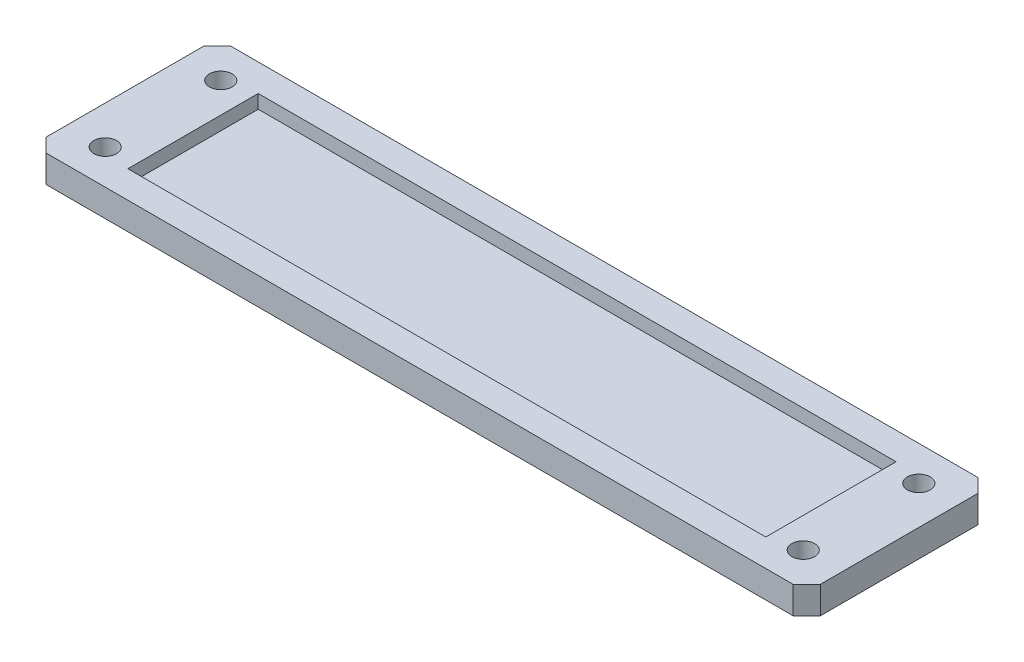
ISO-10303-21;
HEADER;
FILE_DESCRIPTION(('STEP AP214'),'2;1');
FILE_NAME('part.step','',(''),(''),'','','');
FILE_SCHEMA(('AUTOMOTIVE_DESIGN { 1 0 10303 214 1 1 1 1 }'));
ENDSEC;
DATA;
#1=APPLICATION_CONTEXT('core data for automotive mechanical design processes');
#2=APPLICATION_PROTOCOL_DEFINITION('international standard','automotive_design',2000,#1);
#3=PRODUCT_CONTEXT('',#1,'mechanical');
#4=PRODUCT('Part','Part','',(#3));
#5=PRODUCT_RELATED_PRODUCT_CATEGORY('part','',(#4));
#6=PRODUCT_DEFINITION_FORMATION('','',#4);
#7=PRODUCT_DEFINITION_CONTEXT('part definition',#1,'design');
#8=PRODUCT_DEFINITION('design','',#6,#7);
#9=PRODUCT_DEFINITION_SHAPE('','',#8);
#10=(LENGTH_UNIT() NAMED_UNIT(*) SI_UNIT(.MILLI.,.METRE.));
#11=(NAMED_UNIT(*) PLANE_ANGLE_UNIT() SI_UNIT($,.RADIAN.));
#12=(NAMED_UNIT(*) SI_UNIT($,.STERADIAN.) SOLID_ANGLE_UNIT());
#13=UNCERTAINTY_MEASURE_WITH_UNIT(LENGTH_MEASURE(1.E-05),#10,'distance_accuracy_value','');
#14=(GEOMETRIC_REPRESENTATION_CONTEXT(3) GLOBAL_UNCERTAINTY_ASSIGNED_CONTEXT((#13)) GLOBAL_UNIT_ASSIGNED_CONTEXT((#10,
#11,#12)) REPRESENTATION_CONTEXT('',''));
#15=CARTESIAN_POINT('',(0.,0.,0.));
#16=DIRECTION('',(0.,0.,1.));
#17=DIRECTION('',(1.,0.,0.));
#18=AXIS2_PLACEMENT_3D('',#15,#16,#17);
#19=CARTESIAN_POINT('',(0.,6.,0.));
#20=DIRECTION('',(0.,-1.,0.));
#21=DIRECTION('',(0.,0.,-1.));
#22=AXIS2_PLACEMENT_3D('',#19,#20,#21);
#23=PLANE('',#22);
#24=DIRECTION('',(-1.,0.,0.));
#25=VECTOR('',#24,1.);
#26=CARTESIAN_POINT('',(-70.09,6.,-14.32));
#27=LINE('',#26,#25);
#28=CARTESIAN_POINT('',(70.09,6.,-14.32));
#29=VERTEX_POINT('',#28);
#30=CARTESIAN_POINT('',(-70.09,6.,-14.32));
#31=VERTEX_POINT('',#30);
#32=EDGE_CURVE('E233',#29,#31,#27,.T.);
#33=ORIENTED_EDGE('',*,*,#32,.F.);
#34=DIRECTION('',(0.,0.,-1.));
#35=VECTOR('',#34,1.);
#36=CARTESIAN_POINT('',(70.09,6.,-14.32));
#37=LINE('',#36,#35);
#38=CARTESIAN_POINT('',(70.09,6.,14.32));
#39=VERTEX_POINT('',#38);
#40=EDGE_CURVE('E48',#39,#29,#37,.T.);
#41=ORIENTED_EDGE('',*,*,#40,.F.);
#42=DIRECTION('',(1.,0.,0.));
#43=VECTOR('',#42,1.);
#44=CARTESIAN_POINT('',(-70.09,6.,14.32));
#45=LINE('',#44,#43);
#46=CARTESIAN_POINT('',(-70.09,6.,14.32));
#47=VERTEX_POINT('',#46);
#48=EDGE_CURVE('E226',#47,#39,#45,.T.);
#49=ORIENTED_EDGE('',*,*,#48,.F.);
#50=DIRECTION('',(0.,0.,1.));
#51=VECTOR('',#50,1.);
#52=CARTESIAN_POINT('',(-70.09,6.,-14.32));
#53=LINE('',#52,#51);
#54=EDGE_CURVE('E230',#31,#47,#53,.T.);
#55=ORIENTED_EDGE('',*,*,#54,.F.);
#56=EDGE_LOOP('',(#33,#41,#49,#55));
#57=FACE_BOUND('',#56,.T.);
#58=DIRECTION('',(0.,0.,1.));
#59=VECTOR('',#58,1.);
#60=CARTESIAN_POINT('',(-85.09,6.,17.32));
#61=LINE('',#60,#59);
#62=CARTESIAN_POINT('',(-85.09,6.,-17.32));
#63=VERTEX_POINT('',#62);
#64=CARTESIAN_POINT('',(-85.09,6.,17.32));
#65=VERTEX_POINT('',#64);
#66=EDGE_CURVE('E158',#63,#65,#61,.T.);
#67=ORIENTED_EDGE('',*,*,#66,.T.);
#68=DIRECTION('',(0.707106781186548,0.,0.707106781186547));
#69=VECTOR('',#68,1.);
#70=CARTESIAN_POINT('',(-85.09,6.,17.32));
#71=LINE('',#70,#69);
#72=CARTESIAN_POINT('',(-82.09,6.,20.32));
#73=VERTEX_POINT('',#72);
#74=EDGE_CURVE('E98',#65,#73,#71,.T.);
#75=ORIENTED_EDGE('',*,*,#74,.T.);
#76=DIRECTION('',(1.,0.,0.));
#77=VECTOR('',#76,1.);
#78=CARTESIAN_POINT('',(-82.09,6.,20.32));
#79=LINE('',#78,#77);
#80=CARTESIAN_POINT('',(82.09,6.,20.32));
#81=VERTEX_POINT('',#80);
#82=EDGE_CURVE('E173',#73,#81,#79,.T.);
#83=ORIENTED_EDGE('',*,*,#82,.T.);
#84=DIRECTION('',(0.707106781186548,0.,-0.707106781186547));
#85=VECTOR('',#84,1.);
#86=CARTESIAN_POINT('',(82.09,6.,20.32));
#87=LINE('',#86,#85);
#88=CARTESIAN_POINT('',(85.09,6.,17.32));
#89=VERTEX_POINT('',#88);
#90=EDGE_CURVE('E186',#81,#89,#87,.T.);
#91=ORIENTED_EDGE('',*,*,#90,.T.);
#92=DIRECTION('',(0.,0.,-1.));
#93=VECTOR('',#92,1.);
#94=CARTESIAN_POINT('',(85.09,6.,17.32));
#95=LINE('',#94,#93);
#96=CARTESIAN_POINT('',(85.09,6.,-17.32));
#97=VERTEX_POINT('',#96);
#98=EDGE_CURVE('E121',#89,#97,#95,.T.);
#99=ORIENTED_EDGE('',*,*,#98,.T.);
#100=DIRECTION('',(-0.707106781186548,0.,-0.707106781186547));
#101=VECTOR('',#100,1.);
#102=CARTESIAN_POINT('',(82.09,6.,-20.32));
#103=LINE('',#102,#101);
#104=CARTESIAN_POINT('',(82.09,6.,-20.32));
#105=VERTEX_POINT('',#104);
#106=EDGE_CURVE('E114',#97,#105,#103,.T.);
#107=ORIENTED_EDGE('',*,*,#106,.T.);
#108=DIRECTION('',(-1.,0.,0.));
#109=VECTOR('',#108,1.);
#110=CARTESIAN_POINT('',(-82.09,6.,-20.32));
#111=LINE('',#110,#109);
#112=CARTESIAN_POINT('',(-82.09,6.,-20.32));
#113=VERTEX_POINT('',#112);
#114=EDGE_CURVE('E118',#105,#113,#111,.T.);
#115=ORIENTED_EDGE('',*,*,#114,.T.);
#116=DIRECTION('',(-0.707106781186548,0.,0.707106781186547));
#117=VECTOR('',#116,1.);
#118=CARTESIAN_POINT('',(-85.09,6.,-17.32));
#119=LINE('',#118,#117);
#120=EDGE_CURVE('E57',#113,#63,#119,.T.);
#121=ORIENTED_EDGE('',*,*,#120,.T.);
#122=EDGE_LOOP('',(#67,#75,#83,#91,#99,#107,#115,#121));
#123=FACE_BOUND('',#122,.T.);
#124=CARTESIAN_POINT('',(-76.7,6.,-12.7));
#125=DIRECTION('',(0.,1.,0.));
#126=DIRECTION('',(0.,0.,1.));
#127=AXIS2_PLACEMENT_3D('',#124,#125,#126);
#128=CIRCLE('',#127,2.50000000000001);
#129=CARTESIAN_POINT('',(-76.7,6.,-10.2));
#130=VERTEX_POINT('',#129);
#131=EDGE_CURVE('E146',#130,#130,#128,.T.);
#132=ORIENTED_EDGE('',*,*,#131,.F.);
#133=EDGE_LOOP('',(#132));
#134=FACE_BOUND('',#133,.T.);
#135=CARTESIAN_POINT('',(-76.7,6.,12.7));
#136=DIRECTION('',(0.,1.,0.));
#137=DIRECTION('',(0.,0.,1.));
#138=AXIS2_PLACEMENT_3D('',#135,#136,#137);
#139=CIRCLE('',#138,2.5);
#140=CARTESIAN_POINT('',(-76.7,6.,15.2));
#141=VERTEX_POINT('',#140);
#142=EDGE_CURVE('E195',#141,#141,#139,.T.);
#143=ORIENTED_EDGE('',*,*,#142,.F.);
#144=EDGE_LOOP('',(#143));
#145=FACE_BOUND('',#144,.T.);
#146=CARTESIAN_POINT('',(76.7,6.,-12.7));
#147=DIRECTION('',(0.,1.,0.));
#148=DIRECTION('',(0.,0.,1.));
#149=AXIS2_PLACEMENT_3D('',#146,#147,#148);
#150=CIRCLE('',#149,2.49999999999999);
#151=CARTESIAN_POINT('',(76.7,6.,-10.2));
#152=VERTEX_POINT('',#151);
#153=EDGE_CURVE('E201',#152,#152,#150,.T.);
#154=ORIENTED_EDGE('',*,*,#153,.F.);
#155=EDGE_LOOP('',(#154));
#156=FACE_BOUND('',#155,.T.);
#157=CARTESIAN_POINT('',(76.7,6.,12.7));
#158=DIRECTION('',(0.,1.,0.));
#159=DIRECTION('',(0.,0.,1.));
#160=AXIS2_PLACEMENT_3D('',#157,#158,#159);
#161=CIRCLE('',#160,2.49999999999999);
#162=CARTESIAN_POINT('',(76.7,6.,15.2));
#163=VERTEX_POINT('',#162);
#164=EDGE_CURVE('E207',#163,#163,#161,.T.);
#165=ORIENTED_EDGE('',*,*,#164,.F.);
#166=EDGE_LOOP('',(#165));
#167=FACE_BOUND('',#166,.T.);
#168=ADVANCED_FACE('F33',(#57,#123,#134,#145,#156,#167),#23,.F.);
#169=CARTESIAN_POINT('',(0.,0.,0.));
#170=DIRECTION('',(0.,-1.,0.));
#171=DIRECTION('',(0.,0.,-1.));
#172=AXIS2_PLACEMENT_3D('',#169,#170,#171);
#173=PLANE('',#172);
#174=CARTESIAN_POINT('',(76.7,0.,-12.7));
#175=DIRECTION('',(0.,1.,0.));
#176=DIRECTION('',(0.,0.,1.));
#177=AXIS2_PLACEMENT_3D('',#174,#175,#176);
#178=CIRCLE('',#177,2.49999999999999);
#179=CARTESIAN_POINT('',(76.7,0.,-10.2));
#180=VERTEX_POINT('',#179);
#181=EDGE_CURVE('E204',#180,#180,#178,.T.);
#182=ORIENTED_EDGE('',*,*,#181,.T.);
#183=EDGE_LOOP('',(#182));
#184=FACE_BOUND('',#183,.T.);
#185=CARTESIAN_POINT('',(-76.7,0.,-12.7));
#186=DIRECTION('',(0.,1.,0.));
#187=DIRECTION('',(0.,0.,1.));
#188=AXIS2_PLACEMENT_3D('',#185,#186,#187);
#189=CIRCLE('',#188,2.50000000000001);
#190=CARTESIAN_POINT('',(-76.7,0.,-10.2));
#191=VERTEX_POINT('',#190);
#192=EDGE_CURVE('E192',#191,#191,#189,.T.);
#193=ORIENTED_EDGE('',*,*,#192,.T.);
#194=EDGE_LOOP('',(#193));
#195=FACE_BOUND('',#194,.T.);
#196=DIRECTION('',(0.,0.,1.));
#197=VECTOR('',#196,1.);
#198=CARTESIAN_POINT('',(-85.09,0.,17.32));
#199=LINE('',#198,#197);
#200=CARTESIAN_POINT('',(-85.09,0.,-17.32));
#201=VERTEX_POINT('',#200);
#202=CARTESIAN_POINT('',(-85.09,0.,17.32));
#203=VERTEX_POINT('',#202);
#204=EDGE_CURVE('E142',#201,#203,#199,.T.);
#205=ORIENTED_EDGE('',*,*,#204,.F.);
#206=DIRECTION('',(-0.707106781186548,0.,0.707106781186547));
#207=VECTOR('',#206,1.);
#208=CARTESIAN_POINT('',(-85.09,0.,-17.32));
#209=LINE('',#208,#207);
#210=CARTESIAN_POINT('',(-82.09,0.,-20.32));
#211=VERTEX_POINT('',#210);
#212=EDGE_CURVE('E90',#211,#201,#209,.T.);
#213=ORIENTED_EDGE('',*,*,#212,.F.);
#214=DIRECTION('',(-1.,0.,0.));
#215=VECTOR('',#214,1.);
#216=CARTESIAN_POINT('',(-82.09,0.,-20.32));
#217=LINE('',#216,#215);
#218=CARTESIAN_POINT('',(82.09,0.,-20.32));
#219=VERTEX_POINT('',#218);
#220=EDGE_CURVE('E155',#219,#211,#217,.T.);
#221=ORIENTED_EDGE('',*,*,#220,.F.);
#222=DIRECTION('',(-0.707106781186548,0.,-0.707106781186547));
#223=VECTOR('',#222,1.);
#224=CARTESIAN_POINT('',(82.09,0.,-20.32));
#225=LINE('',#224,#223);
#226=CARTESIAN_POINT('',(85.09,0.,-17.32));
#227=VERTEX_POINT('',#226);
#228=EDGE_CURVE('E130',#227,#219,#225,.T.);
#229=ORIENTED_EDGE('',*,*,#228,.F.);
#230=DIRECTION('',(0.,0.,-1.));
#231=VECTOR('',#230,1.);
#232=CARTESIAN_POINT('',(85.09,0.,17.32));
#233=LINE('',#232,#231);
#234=CARTESIAN_POINT('',(85.09,0.,17.32));
#235=VERTEX_POINT('',#234);
#236=EDGE_CURVE('E152',#235,#227,#233,.T.);
#237=ORIENTED_EDGE('',*,*,#236,.F.);
#238=DIRECTION('',(0.707106781186548,0.,-0.707106781186547));
#239=VECTOR('',#238,1.);
#240=CARTESIAN_POINT('',(82.09,0.,20.32));
#241=LINE('',#240,#239);
#242=CARTESIAN_POINT('',(82.09,0.,20.32));
#243=VERTEX_POINT('',#242);
#244=EDGE_CURVE('E150',#243,#235,#241,.T.);
#245=ORIENTED_EDGE('',*,*,#244,.F.);
#246=DIRECTION('',(1.,0.,0.));
#247=VECTOR('',#246,1.);
#248=CARTESIAN_POINT('',(-82.09,0.,20.32));
#249=LINE('',#248,#247);
#250=CARTESIAN_POINT('',(-82.09,0.,20.32));
#251=VERTEX_POINT('',#250);
#252=EDGE_CURVE('E148',#251,#243,#249,.T.);
#253=ORIENTED_EDGE('',*,*,#252,.F.);
#254=DIRECTION('',(0.707106781186548,0.,0.707106781186547));
#255=VECTOR('',#254,1.);
#256=CARTESIAN_POINT('',(-85.09,0.,17.32));
#257=LINE('',#256,#255);
#258=EDGE_CURVE('E145',#203,#251,#257,.T.);
#259=ORIENTED_EDGE('',*,*,#258,.F.);
#260=EDGE_LOOP('',(#205,#213,#221,#229,#237,#245,#253,#259));
#261=FACE_BOUND('',#260,.T.);
#262=CARTESIAN_POINT('',(-76.7,0.,12.7));
#263=DIRECTION('',(0.,1.,0.));
#264=DIRECTION('',(0.,0.,1.));
#265=AXIS2_PLACEMENT_3D('',#262,#263,#264);
#266=CIRCLE('',#265,2.5);
#267=CARTESIAN_POINT('',(-76.7,0.,15.2));
#268=VERTEX_POINT('',#267);
#269=EDGE_CURVE('E198',#268,#268,#266,.T.);
#270=ORIENTED_EDGE('',*,*,#269,.T.);
#271=EDGE_LOOP('',(#270));
#272=FACE_BOUND('',#271,.T.);
#273=CARTESIAN_POINT('',(76.7,0.,12.7));
#274=DIRECTION('',(0.,1.,0.));
#275=DIRECTION('',(0.,0.,1.));
#276=AXIS2_PLACEMENT_3D('',#273,#274,#275);
#277=CIRCLE('',#276,2.49999999999999);
#278=CARTESIAN_POINT('',(76.7,0.,15.2));
#279=VERTEX_POINT('',#278);
#280=EDGE_CURVE('E210',#279,#279,#277,.T.);
#281=ORIENTED_EDGE('',*,*,#280,.T.);
#282=EDGE_LOOP('',(#281));
#283=FACE_BOUND('',#282,.T.);
#284=ADVANCED_FACE('F177',(#184,#195,#261,#272,#283),#173,.T.);
#285=CARTESIAN_POINT('',(-85.09,6.,17.32));
#286=DIRECTION('',(1.,0.,0.));
#287=DIRECTION('',(0.,0.,-1.));
#288=AXIS2_PLACEMENT_3D('',#285,#286,#287);
#289=PLANE('',#288);
#290=ORIENTED_EDGE('',*,*,#204,.T.);
#291=DIRECTION('',(0.,-1.,0.));
#292=VECTOR('',#291,1.);
#293=CARTESIAN_POINT('',(-85.09,6.,17.32));
#294=LINE('',#293,#292);
#295=EDGE_CURVE('E11',#65,#203,#294,.T.);
#296=ORIENTED_EDGE('',*,*,#295,.F.);
#297=ORIENTED_EDGE('',*,*,#66,.F.);
#298=DIRECTION('',(0.,-1.,0.));
#299=VECTOR('',#298,1.);
#300=CARTESIAN_POINT('',(-85.09,6.,-17.32));
#301=LINE('',#300,#299);
#302=EDGE_CURVE('E138',#63,#201,#301,.T.);
#303=ORIENTED_EDGE('',*,*,#302,.T.);
#304=EDGE_LOOP('',(#290,#296,#297,#303));
#305=FACE_BOUND('',#304,.T.);
#306=ADVANCED_FACE('F35',(#305),#289,.F.);
#307=CARTESIAN_POINT('',(-85.09,6.,17.32));
#308=DIRECTION('',(0.707106781186547,0.,-0.707106781186548));
#309=DIRECTION('',(-0.707106781186548,0.,-0.707106781186547));
#310=AXIS2_PLACEMENT_3D('',#307,#308,#309);
#311=PLANE('',#310);
#312=ORIENTED_EDGE('',*,*,#258,.T.);
#313=DIRECTION('',(0.,-1.,0.));
#314=VECTOR('',#313,1.);
#315=CARTESIAN_POINT('',(-82.09,6.,20.32));
#316=LINE('',#315,#314);
#317=EDGE_CURVE('E41',#73,#251,#316,.T.);
#318=ORIENTED_EDGE('',*,*,#317,.F.);
#319=ORIENTED_EDGE('',*,*,#74,.F.);
#320=ORIENTED_EDGE('',*,*,#295,.T.);
#321=EDGE_LOOP('',(#312,#318,#319,#320));
#322=FACE_BOUND('',#321,.T.);
#323=ADVANCED_FACE('F308',(#322),#311,.F.);
#324=CARTESIAN_POINT('',(-82.09,6.,20.32));
#325=DIRECTION('',(0.,0.,-1.));
#326=DIRECTION('',(-1.,0.,0.));
#327=AXIS2_PLACEMENT_3D('',#324,#325,#326);
#328=PLANE('',#327);
#329=ORIENTED_EDGE('',*,*,#252,.T.);
#330=DIRECTION('',(0.,-1.,0.));
#331=VECTOR('',#330,1.);
#332=CARTESIAN_POINT('',(82.09,6.,20.32));
#333=LINE('',#332,#331);
#334=EDGE_CURVE('E165',#81,#243,#333,.T.);
#335=ORIENTED_EDGE('',*,*,#334,.F.);
#336=ORIENTED_EDGE('',*,*,#82,.F.);
#337=ORIENTED_EDGE('',*,*,#317,.T.);
#338=EDGE_LOOP('',(#329,#335,#336,#337));
#339=FACE_BOUND('',#338,.T.);
#340=ADVANCED_FACE('F171',(#339),#328,.F.);
#341=CARTESIAN_POINT('',(82.09,6.,20.32));
#342=DIRECTION('',(-0.707106781186547,0.,-0.707106781186548));
#343=DIRECTION('',(-0.707106781186548,0.,0.707106781186547));
#344=AXIS2_PLACEMENT_3D('',#341,#342,#343);
#345=PLANE('',#344);
#346=ORIENTED_EDGE('',*,*,#244,.T.);
#347=DIRECTION('',(0.,-1.,0.));
#348=VECTOR('',#347,1.);
#349=CARTESIAN_POINT('',(85.09,6.,17.32));
#350=LINE('',#349,#348);
#351=EDGE_CURVE('E162',#89,#235,#350,.T.);
#352=ORIENTED_EDGE('',*,*,#351,.F.);
#353=ORIENTED_EDGE('',*,*,#90,.F.);
#354=ORIENTED_EDGE('',*,*,#334,.T.);
#355=EDGE_LOOP('',(#346,#352,#353,#354));
#356=FACE_BOUND('',#355,.T.);
#357=ADVANCED_FACE('F182',(#356),#345,.F.);
#358=CARTESIAN_POINT('',(85.09,6.,17.32));
#359=DIRECTION('',(-1.,0.,0.));
#360=DIRECTION('',(0.,0.,1.));
#361=AXIS2_PLACEMENT_3D('',#358,#359,#360);
#362=PLANE('',#361);
#363=ORIENTED_EDGE('',*,*,#236,.T.);
#364=DIRECTION('',(0.,-1.,0.));
#365=VECTOR('',#364,1.);
#366=CARTESIAN_POINT('',(85.09,6.,-17.32));
#367=LINE('',#366,#365);
#368=EDGE_CURVE('E133',#97,#227,#367,.T.);
#369=ORIENTED_EDGE('',*,*,#368,.F.);
#370=ORIENTED_EDGE('',*,*,#98,.F.);
#371=ORIENTED_EDGE('',*,*,#351,.T.);
#372=EDGE_LOOP('',(#363,#369,#370,#371));
#373=FACE_BOUND('',#372,.T.);
#374=ADVANCED_FACE('F185',(#373),#362,.F.);
#375=CARTESIAN_POINT('',(82.09,6.,-20.32));
#376=DIRECTION('',(-0.707106781186547,0.,0.707106781186548));
#377=DIRECTION('',(0.707106781186548,0.,0.707106781186547));
#378=AXIS2_PLACEMENT_3D('',#375,#376,#377);
#379=PLANE('',#378);
#380=ORIENTED_EDGE('',*,*,#228,.T.);
#381=DIRECTION('',(0.,-1.,0.));
#382=VECTOR('',#381,1.);
#383=CARTESIAN_POINT('',(82.09,6.,-20.32));
#384=LINE('',#383,#382);
#385=EDGE_CURVE('E127',#105,#219,#384,.T.);
#386=ORIENTED_EDGE('',*,*,#385,.F.);
#387=ORIENTED_EDGE('',*,*,#106,.F.);
#388=ORIENTED_EDGE('',*,*,#368,.T.);
#389=EDGE_LOOP('',(#380,#386,#387,#388));
#390=FACE_BOUND('',#389,.T.);
#391=ADVANCED_FACE('F128',(#390),#379,.F.);
#392=CARTESIAN_POINT('',(-82.09,6.,-20.32));
#393=DIRECTION('',(0.,0.,1.));
#394=DIRECTION('',(1.,0.,0.));
#395=AXIS2_PLACEMENT_3D('',#392,#393,#394);
#396=PLANE('',#395);
#397=ORIENTED_EDGE('',*,*,#220,.T.);
#398=DIRECTION('',(0.,-1.,0.));
#399=VECTOR('',#398,1.);
#400=CARTESIAN_POINT('',(-82.09,6.,-20.32));
#401=LINE('',#400,#399);
#402=EDGE_CURVE('E134',#113,#211,#401,.T.);
#403=ORIENTED_EDGE('',*,*,#402,.F.);
#404=ORIENTED_EDGE('',*,*,#114,.F.);
#405=ORIENTED_EDGE('',*,*,#385,.T.);
#406=EDGE_LOOP('',(#397,#403,#404,#405));
#407=FACE_BOUND('',#406,.T.);
#408=ADVANCED_FACE('F136',(#407),#396,.F.);
#409=CARTESIAN_POINT('',(-85.09,6.,-17.32));
#410=DIRECTION('',(0.707106781186547,0.,0.707106781186548));
#411=DIRECTION('',(0.707106781186548,0.,-0.707106781186547));
#412=AXIS2_PLACEMENT_3D('',#409,#410,#411);
#413=PLANE('',#412);
#414=ORIENTED_EDGE('',*,*,#212,.T.);
#415=ORIENTED_EDGE('',*,*,#302,.F.);
#416=ORIENTED_EDGE('',*,*,#120,.F.);
#417=ORIENTED_EDGE('',*,*,#402,.T.);
#418=EDGE_LOOP('',(#414,#415,#416,#417));
#419=FACE_BOUND('',#418,.T.);
#420=ADVANCED_FACE('F296',(#419),#413,.F.);
#421=CARTESIAN_POINT('',(-76.7,6.,-12.7));
#422=DIRECTION('',(0.,-1.,0.));
#423=DIRECTION('',(0.,0.,-1.));
#424=AXIS2_PLACEMENT_3D('',#421,#422,#423);
#425=CYLINDRICAL_SURFACE('',#424,2.50000000000001);
#426=ORIENTED_EDGE('',*,*,#131,.T.);
#427=EDGE_LOOP('',(#426));
#428=FACE_BOUND('',#427,.T.);
#429=ORIENTED_EDGE('',*,*,#192,.F.);
#430=EDGE_LOOP('',(#429));
#431=FACE_BOUND('',#430,.T.);
#432=ADVANCED_FACE('F293',(#428,#431),#425,.F.);
#433=CARTESIAN_POINT('',(-76.7,6.,12.7));
#434=DIRECTION('',(0.,-1.,0.));
#435=DIRECTION('',(0.,0.,-1.));
#436=AXIS2_PLACEMENT_3D('',#433,#434,#435);
#437=CYLINDRICAL_SURFACE('',#436,2.5);
#438=ORIENTED_EDGE('',*,*,#142,.T.);
#439=EDGE_LOOP('',(#438));
#440=FACE_BOUND('',#439,.T.);
#441=ORIENTED_EDGE('',*,*,#269,.F.);
#442=EDGE_LOOP('',(#441));
#443=FACE_BOUND('',#442,.T.);
#444=ADVANCED_FACE('F371',(#440,#443),#437,.F.);
#445=CARTESIAN_POINT('',(76.7,6.,-12.7));
#446=DIRECTION('',(0.,-1.,0.));
#447=DIRECTION('',(0.,0.,-1.));
#448=AXIS2_PLACEMENT_3D('',#445,#446,#447);
#449=CYLINDRICAL_SURFACE('',#448,2.49999999999999);
#450=ORIENTED_EDGE('',*,*,#153,.T.);
#451=EDGE_LOOP('',(#450));
#452=FACE_BOUND('',#451,.T.);
#453=ORIENTED_EDGE('',*,*,#181,.F.);
#454=EDGE_LOOP('',(#453));
#455=FACE_BOUND('',#454,.T.);
#456=ADVANCED_FACE('F379',(#452,#455),#449,.F.);
#457=CARTESIAN_POINT('',(76.7,6.,12.7));
#458=DIRECTION('',(0.,-1.,0.));
#459=DIRECTION('',(0.,0.,-1.));
#460=AXIS2_PLACEMENT_3D('',#457,#458,#459);
#461=CYLINDRICAL_SURFACE('',#460,2.49999999999999);
#462=ORIENTED_EDGE('',*,*,#164,.T.);
#463=EDGE_LOOP('',(#462));
#464=FACE_BOUND('',#463,.T.);
#465=ORIENTED_EDGE('',*,*,#280,.F.);
#466=EDGE_LOOP('',(#465));
#467=FACE_BOUND('',#466,.T.);
#468=ADVANCED_FACE('F387',(#464,#467),#461,.F.);
#469=CARTESIAN_POINT('',(70.09,3.,-14.32));
#470=DIRECTION('',(1.,0.,0.));
#471=DIRECTION('',(0.,0.,-1.));
#472=AXIS2_PLACEMENT_3D('',#469,#470,#471);
#473=PLANE('',#472);
#474=ORIENTED_EDGE('',*,*,#40,.T.);
#475=DIRECTION('',(0.,1.,0.));
#476=VECTOR('',#475,1.);
#477=CARTESIAN_POINT('',(70.09,3.,-14.32));
#478=LINE('',#477,#476);
#479=CARTESIAN_POINT('',(70.09,3.,-14.32));
#480=VERTEX_POINT('',#479);
#481=EDGE_CURVE('E216',#480,#29,#478,.T.);
#482=ORIENTED_EDGE('',*,*,#481,.F.);
#483=DIRECTION('',(0.,0.,-1.));
#484=VECTOR('',#483,1.);
#485=CARTESIAN_POINT('',(70.09,3.,-14.32));
#486=LINE('',#485,#484);
#487=CARTESIAN_POINT('',(70.09,3.,14.32));
#488=VERTEX_POINT('',#487);
#489=EDGE_CURVE('E229',#488,#480,#486,.T.);
#490=ORIENTED_EDGE('',*,*,#489,.F.);
#491=DIRECTION('',(0.,1.,0.));
#492=VECTOR('',#491,1.);
#493=CARTESIAN_POINT('',(70.09,3.,14.32));
#494=LINE('',#493,#492);
#495=EDGE_CURVE('E213',#488,#39,#494,.T.);
#496=ORIENTED_EDGE('',*,*,#495,.T.);
#497=EDGE_LOOP('',(#474,#482,#490,#496));
#498=FACE_BOUND('',#497,.T.);
#499=ADVANCED_FACE('F254',(#498),#473,.F.);
#500=CARTESIAN_POINT('',(-70.09,3.,14.32));
#501=DIRECTION('',(0.,0.,1.));
#502=DIRECTION('',(1.,0.,0.));
#503=AXIS2_PLACEMENT_3D('',#500,#501,#502);
#504=PLANE('',#503);
#505=ORIENTED_EDGE('',*,*,#48,.T.);
#506=ORIENTED_EDGE('',*,*,#495,.F.);
#507=DIRECTION('',(1.,0.,0.));
#508=VECTOR('',#507,1.);
#509=CARTESIAN_POINT('',(-70.09,3.,14.32));
#510=LINE('',#509,#508);
#511=CARTESIAN_POINT('',(-70.09,3.,14.32));
#512=VERTEX_POINT('',#511);
#513=EDGE_CURVE('E219',#512,#488,#510,.T.);
#514=ORIENTED_EDGE('',*,*,#513,.F.);
#515=DIRECTION('',(0.,1.,0.));
#516=VECTOR('',#515,1.);
#517=CARTESIAN_POINT('',(-70.09,3.,14.32));
#518=LINE('',#517,#516);
#519=EDGE_CURVE('E222',#512,#47,#518,.T.);
#520=ORIENTED_EDGE('',*,*,#519,.T.);
#521=EDGE_LOOP('',(#505,#506,#514,#520));
#522=FACE_BOUND('',#521,.T.);
#523=ADVANCED_FACE('F265',(#522),#504,.F.);
#524=CARTESIAN_POINT('',(-70.09,3.,-14.32));
#525=DIRECTION('',(-1.,0.,0.));
#526=DIRECTION('',(0.,0.,1.));
#527=AXIS2_PLACEMENT_3D('',#524,#525,#526);
#528=PLANE('',#527);
#529=ORIENTED_EDGE('',*,*,#54,.T.);
#530=ORIENTED_EDGE('',*,*,#519,.F.);
#531=DIRECTION('',(0.,0.,1.));
#532=VECTOR('',#531,1.);
#533=CARTESIAN_POINT('',(-70.09,3.,-14.32));
#534=LINE('',#533,#532);
#535=CARTESIAN_POINT('',(-70.09,3.,-14.32));
#536=VERTEX_POINT('',#535);
#537=EDGE_CURVE('E239',#536,#512,#534,.T.);
#538=ORIENTED_EDGE('',*,*,#537,.F.);
#539=DIRECTION('',(0.,1.,0.));
#540=VECTOR('',#539,1.);
#541=CARTESIAN_POINT('',(-70.09,3.,-14.32));
#542=LINE('',#541,#540);
#543=EDGE_CURVE('E218',#536,#31,#542,.T.);
#544=ORIENTED_EDGE('',*,*,#543,.T.);
#545=EDGE_LOOP('',(#529,#530,#538,#544));
#546=FACE_BOUND('',#545,.T.);
#547=ADVANCED_FACE('F270',(#546),#528,.F.);
#548=CARTESIAN_POINT('',(-70.09,3.,-14.32));
#549=DIRECTION('',(0.,0.,-1.));
#550=DIRECTION('',(-1.,0.,0.));
#551=AXIS2_PLACEMENT_3D('',#548,#549,#550);
#552=PLANE('',#551);
#553=ORIENTED_EDGE('',*,*,#32,.T.);
#554=ORIENTED_EDGE('',*,*,#543,.F.);
#555=DIRECTION('',(-1.,0.,0.));
#556=VECTOR('',#555,1.);
#557=CARTESIAN_POINT('',(-70.09,3.,-14.32));
#558=LINE('',#557,#556);
#559=EDGE_CURVE('E242',#480,#536,#558,.T.);
#560=ORIENTED_EDGE('',*,*,#559,.F.);
#561=ORIENTED_EDGE('',*,*,#481,.T.);
#562=EDGE_LOOP('',(#553,#554,#560,#561));
#563=FACE_BOUND('',#562,.T.);
#564=ADVANCED_FACE('F275',(#563),#552,.F.);
#565=CARTESIAN_POINT('',(0.,3.,0.));
#566=DIRECTION('',(0.,1.,0.));
#567=DIRECTION('',(0.,0.,1.));
#568=AXIS2_PLACEMENT_3D('',#565,#566,#567);
#569=PLANE('',#568);
#570=ORIENTED_EDGE('',*,*,#489,.T.);
#571=ORIENTED_EDGE('',*,*,#559,.T.);
#572=ORIENTED_EDGE('',*,*,#537,.T.);
#573=ORIENTED_EDGE('',*,*,#513,.T.);
#574=EDGE_LOOP('',(#570,#571,#572,#573));
#575=FACE_BOUND('',#574,.T.);
#576=ADVANCED_FACE('F249',(#575),#569,.T.);
#577=CLOSED_SHELL('',(#168,#284,#306,#323,#340,#357,#374,#391,#408,#420,#432,#444,#456,#468,
#499,#523,#547,#564,#576));
#578=MANIFOLD_SOLID_BREP('B2',#577);
#579=ADVANCED_BREP_SHAPE_REPRESENTATION('',(#18,#578),#14);
#580=SHAPE_DEFINITION_REPRESENTATION(#9,#579);
ENDSEC;
END-ISO-10303-21;
